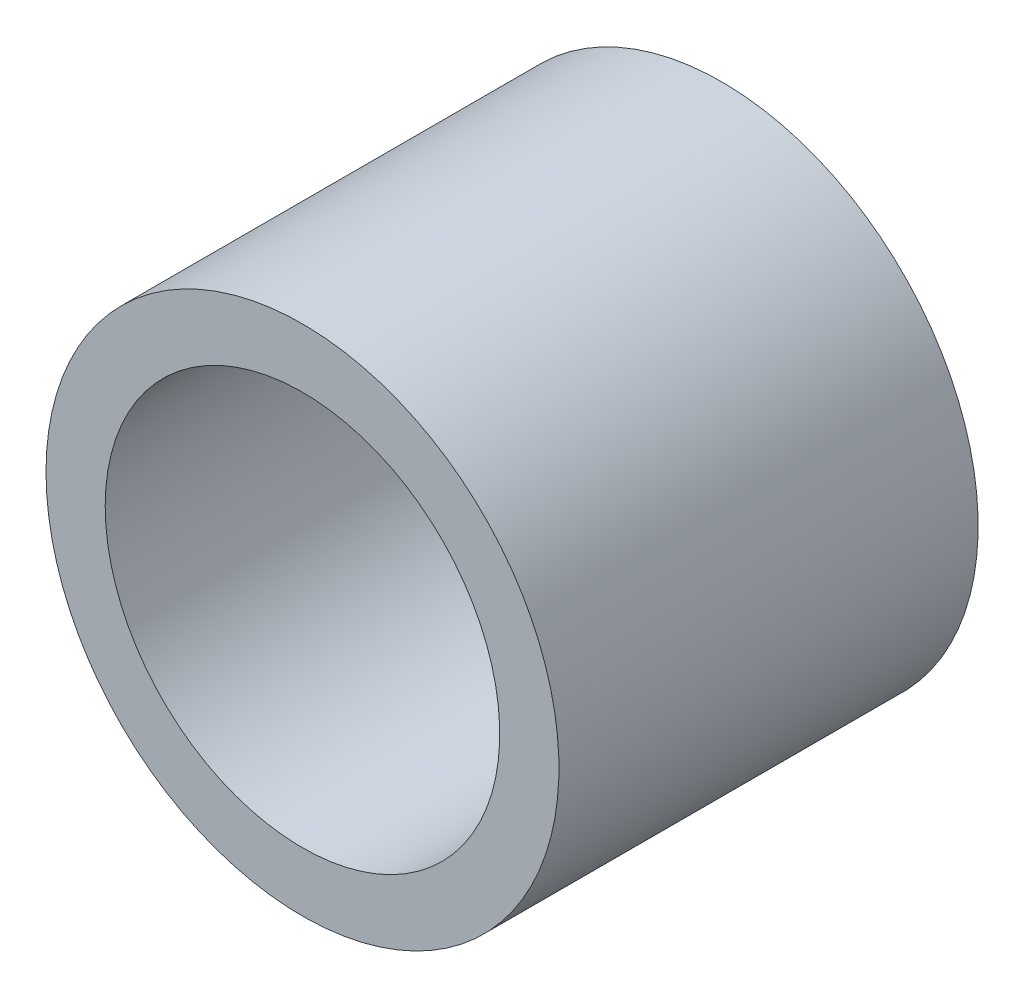
ISO-10303-21;
HEADER;
FILE_DESCRIPTION(('STEP AP214'),'2;1');
FILE_NAME('part.step','',(''),(''),'','','');
FILE_SCHEMA(('AUTOMOTIVE_DESIGN { 1 0 10303 214 1 1 1 1 }'));
ENDSEC;
DATA;
#1=APPLICATION_CONTEXT('core data for automotive mechanical design processes');
#2=APPLICATION_PROTOCOL_DEFINITION('international standard','automotive_design',2000,#1);
#3=PRODUCT_CONTEXT('',#1,'mechanical');
#4=PRODUCT('Part','Part','',(#3));
#5=PRODUCT_RELATED_PRODUCT_CATEGORY('part','',(#4));
#6=PRODUCT_DEFINITION_FORMATION('','',#4);
#7=PRODUCT_DEFINITION_CONTEXT('part definition',#1,'design');
#8=PRODUCT_DEFINITION('design','',#6,#7);
#9=PRODUCT_DEFINITION_SHAPE('','',#8);
#10=(LENGTH_UNIT() NAMED_UNIT(*) SI_UNIT(.MILLI.,.METRE.));
#11=(NAMED_UNIT(*) PLANE_ANGLE_UNIT() SI_UNIT($,.RADIAN.));
#12=(NAMED_UNIT(*) SI_UNIT($,.STERADIAN.) SOLID_ANGLE_UNIT());
#13=UNCERTAINTY_MEASURE_WITH_UNIT(LENGTH_MEASURE(1.E-05),#10,'distance_accuracy_value','');
#14=(GEOMETRIC_REPRESENTATION_CONTEXT(3) GLOBAL_UNCERTAINTY_ASSIGNED_CONTEXT((#13)) GLOBAL_UNIT_ASSIGNED_CONTEXT((#10,
#11,#12)) REPRESENTATION_CONTEXT('',''));
#15=CARTESIAN_POINT('',(0.,0.,0.));
#16=DIRECTION('',(0.,0.,1.));
#17=DIRECTION('',(1.,0.,0.));
#18=AXIS2_PLACEMENT_3D('',#15,#16,#17);
#19=CARTESIAN_POINT('',(0.,0.,21.59));
#20=DIRECTION('',(0.,0.,-1.));
#21=DIRECTION('',(-1.,0.,0.));
#22=AXIS2_PLACEMENT_3D('',#19,#20,#21);
#23=CYLINDRICAL_SURFACE('',#22,10.16);
#24=CARTESIAN_POINT('',(0.,0.,0.));
#25=DIRECTION('',(0.,0.,-1.));
#26=DIRECTION('',(-1.,0.,0.));
#27=AXIS2_PLACEMENT_3D('',#24,#25,#26);
#28=CIRCLE('',#27,10.16);
#29=CARTESIAN_POINT('',(-10.16,0.,0.));
#30=VERTEX_POINT('',#29);
#31=EDGE_CURVE('E24',#30,#30,#28,.T.);
#32=ORIENTED_EDGE('',*,*,#31,.T.);
#33=EDGE_LOOP('',(#32));
#34=FACE_BOUND('',#33,.T.);
#35=CARTESIAN_POINT('',(0.,0.,21.59));
#36=DIRECTION('',(0.,0.,-1.));
#37=DIRECTION('',(-1.,0.,0.));
#38=AXIS2_PLACEMENT_3D('',#35,#36,#37);
#39=CIRCLE('',#38,10.16);
#40=CARTESIAN_POINT('',(-10.16,0.,21.59));
#41=VERTEX_POINT('',#40);
#42=EDGE_CURVE('E15',#41,#41,#39,.T.);
#43=ORIENTED_EDGE('',*,*,#42,.F.);
#44=EDGE_LOOP('',(#43));
#45=FACE_BOUND('',#44,.T.);
#46=ADVANCED_FACE('F12',(#34,#45),#23,.F.);
#47=CARTESIAN_POINT('',(0.,0.,21.59));
#48=DIRECTION('',(0.,0.,1.));
#49=DIRECTION('',(1.,0.,0.));
#50=AXIS2_PLACEMENT_3D('',#47,#48,#49);
#51=PLANE('',#50);
#52=ORIENTED_EDGE('',*,*,#42,.T.);
#53=EDGE_LOOP('',(#52));
#54=FACE_BOUND('',#53,.T.);
#55=CARTESIAN_POINT('',(0.,0.,21.59));
#56=DIRECTION('',(0.,0.,-1.));
#57=DIRECTION('',(-1.,0.,0.));
#58=AXIS2_PLACEMENT_3D('',#55,#56,#57);
#59=CIRCLE('',#58,13.208);
#60=CARTESIAN_POINT('',(-13.208,0.,21.59));
#61=VERTEX_POINT('',#60);
#62=EDGE_CURVE('E19',#61,#61,#59,.T.);
#63=ORIENTED_EDGE('',*,*,#62,.F.);
#64=EDGE_LOOP('',(#63));
#65=FACE_BOUND('',#64,.T.);
#66=ADVANCED_FACE('F32',(#54,#65),#51,.T.);
#67=CARTESIAN_POINT('',(0.,0.,0.));
#68=DIRECTION('',(0.,0.,1.));
#69=DIRECTION('',(1.,0.,0.));
#70=AXIS2_PLACEMENT_3D('',#67,#68,#69);
#71=PLANE('',#70);
#72=ORIENTED_EDGE('',*,*,#31,.F.);
#73=EDGE_LOOP('',(#72));
#74=FACE_BOUND('',#73,.T.);
#75=CARTESIAN_POINT('',(0.,0.,0.));
#76=DIRECTION('',(0.,0.,-1.));
#77=DIRECTION('',(-1.,0.,0.));
#78=AXIS2_PLACEMENT_3D('',#75,#76,#77);
#79=CIRCLE('',#78,13.208);
#80=CARTESIAN_POINT('',(-13.208,0.,0.));
#81=VERTEX_POINT('',#80);
#82=EDGE_CURVE('E8',#81,#81,#79,.F.);
#83=ORIENTED_EDGE('',*,*,#82,.F.);
#84=EDGE_LOOP('',(#83));
#85=FACE_BOUND('',#84,.T.);
#86=ADVANCED_FACE('F40',(#74,#85),#71,.F.);
#87=CARTESIAN_POINT('',(0.,0.,21.59));
#88=DIRECTION('',(0.,0.,-1.));
#89=DIRECTION('',(-1.,0.,0.));
#90=AXIS2_PLACEMENT_3D('',#87,#88,#89);
#91=CYLINDRICAL_SURFACE('',#90,13.208);
#92=ORIENTED_EDGE('',*,*,#82,.T.);
#93=EDGE_LOOP('',(#92));
#94=FACE_BOUND('',#93,.T.);
#95=ORIENTED_EDGE('',*,*,#62,.T.);
#96=EDGE_LOOP('',(#95));
#97=FACE_BOUND('',#96,.T.);
#98=ADVANCED_FACE('F41',(#94,#97),#91,.T.);
#99=CLOSED_SHELL('',(#46,#66,#86,#98));
#100=MANIFOLD_SOLID_BREP('B1',#99);
#101=ADVANCED_BREP_SHAPE_REPRESENTATION('',(#18,#100),#14);
#102=SHAPE_DEFINITION_REPRESENTATION(#9,#101);
ENDSEC;
END-ISO-10303-21;
